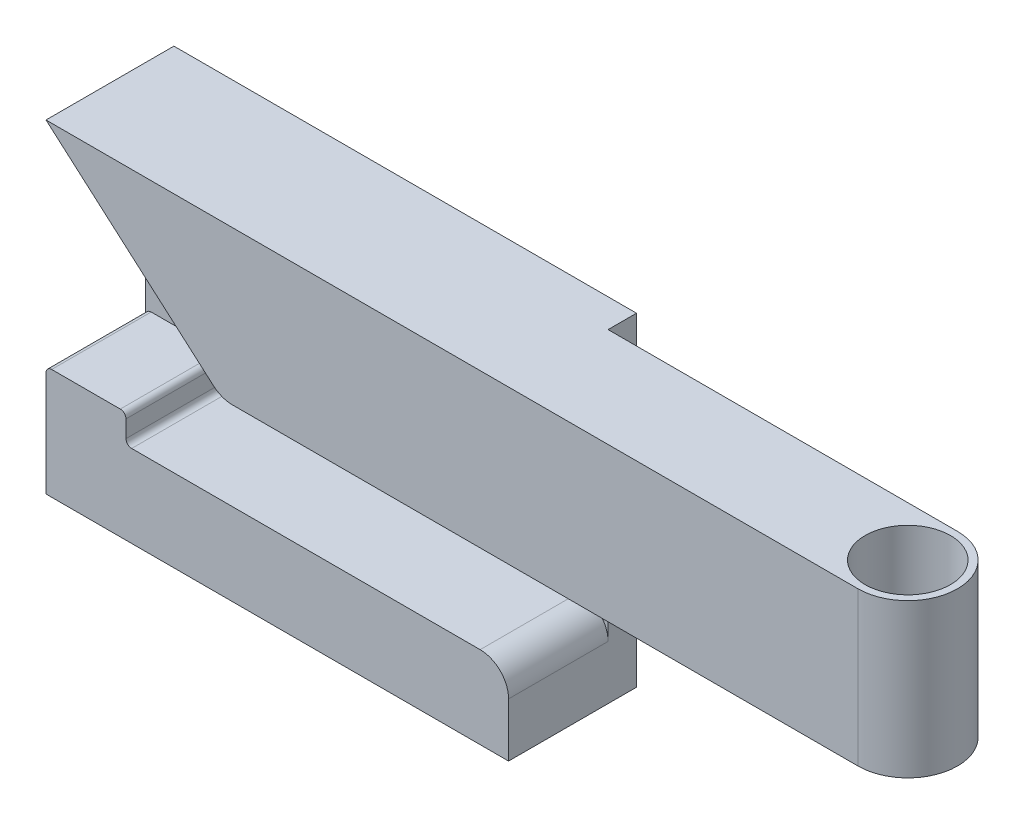
ISO-10303-21;
HEADER;
FILE_DESCRIPTION(('STEP AP214'),'2;1');
FILE_NAME('part.step','',(''),(''),'','','');
FILE_SCHEMA(('AUTOMOTIVE_DESIGN { 1 0 10303 214 1 1 1 1 }'));
ENDSEC;
DATA;
#1=APPLICATION_CONTEXT('core data for automotive mechanical design processes');
#2=APPLICATION_PROTOCOL_DEFINITION('international standard','automotive_design',2000,#1);
#3=PRODUCT_CONTEXT('',#1,'mechanical');
#4=PRODUCT('Part','Part','',(#3));
#5=PRODUCT_RELATED_PRODUCT_CATEGORY('part','',(#4));
#6=PRODUCT_DEFINITION_FORMATION('','',#4);
#7=PRODUCT_DEFINITION_CONTEXT('part definition',#1,'design');
#8=PRODUCT_DEFINITION('design','',#6,#7);
#9=PRODUCT_DEFINITION_SHAPE('','',#8);
#10=(LENGTH_UNIT() NAMED_UNIT(*) SI_UNIT(.MILLI.,.METRE.));
#11=(NAMED_UNIT(*) PLANE_ANGLE_UNIT() SI_UNIT($,.RADIAN.));
#12=(NAMED_UNIT(*) SI_UNIT($,.STERADIAN.) SOLID_ANGLE_UNIT());
#13=UNCERTAINTY_MEASURE_WITH_UNIT(LENGTH_MEASURE(1.E-05),#10,'distance_accuracy_value','');
#14=(GEOMETRIC_REPRESENTATION_CONTEXT(3) GLOBAL_UNCERTAINTY_ASSIGNED_CONTEXT((#13)) GLOBAL_UNIT_ASSIGNED_CONTEXT((#10,
#11,#12)) REPRESENTATION_CONTEXT('',''));
#15=CARTESIAN_POINT('',(0.,0.,0.));
#16=DIRECTION('',(0.,0.,1.));
#17=DIRECTION('',(1.,0.,0.));
#18=AXIS2_PLACEMENT_3D('',#15,#16,#17);
#19=CARTESIAN_POINT('',(0.,0.,0.));
#20=DIRECTION('',(0.,0.,1.));
#21=DIRECTION('',(1.,0.,0.));
#22=AXIS2_PLACEMENT_3D('',#19,#20,#21);
#23=PLANE('',#22);
#24=DIRECTION('',(0.,1.,0.));
#25=VECTOR('',#24,1.);
#26=CARTESIAN_POINT('',(28.1359432064245,-0.578882054731753,0.));
#27=LINE('',#26,#25);
#28=CARTESIAN_POINT('',(28.1359432064245,1.42111794526825,0.));
#29=VERTEX_POINT('',#28);
#30=CARTESIAN_POINT('',(28.1359432064245,7.42111794526825,0.));
#31=VERTEX_POINT('',#30);
#32=EDGE_CURVE('E228',#29,#31,#27,.T.);
#33=ORIENTED_EDGE('',*,*,#32,.F.);
#34=CARTESIAN_POINT('',(30.1359432064245,1.42111794526825,0.));
#35=DIRECTION('',(0.,0.,1.));
#36=DIRECTION('',(1.,0.,0.));
#37=AXIS2_PLACEMENT_3D('',#34,#35,#36);
#38=CIRCLE('',#37,2.);
#39=CARTESIAN_POINT('',(30.1359432064245,-0.578882054731753,0.));
#40=VERTEX_POINT('',#39);
#41=EDGE_CURVE('E241',#29,#40,#38,.T.);
#42=ORIENTED_EDGE('',*,*,#41,.T.);
#43=DIRECTION('',(-1.,0.,0.));
#44=VECTOR('',#43,1.);
#45=CARTESIAN_POINT('',(28.1359432064245,-0.578882054731753,0.));
#46=LINE('',#45,#44);
#47=CARTESIAN_POINT('',(152.732130766672,-0.578882054731721,0.));
#48=VERTEX_POINT('',#47);
#49=EDGE_CURVE('E209',#48,#40,#46,.T.);
#50=ORIENTED_EDGE('',*,*,#49,.F.);
#51=CARTESIAN_POINT('',(152.732130766672,-10.5788820547317,0.));
#52=DIRECTION('',(0.,0.,1.));
#53=DIRECTION('',(1.,0.,0.));
#54=AXIS2_PLACEMENT_3D('',#51,#52,#53);
#55=CIRCLE('',#54,10.);
#56=CARTESIAN_POINT('',(162.732130766672,-10.5788820547317,0.));
#57=VERTEX_POINT('',#56);
#58=EDGE_CURVE('E41',#48,#57,#55,.F.);
#59=ORIENTED_EDGE('',*,*,#58,.T.);
#60=DIRECTION('',(0.,-1.,0.));
#61=VECTOR('',#60,1.);
#62=CARTESIAN_POINT('',(162.732130766672,84.4272602811582,0.));
#63=LINE('',#62,#61);
#64=CARTESIAN_POINT('',(162.732130766672,30.4211179452683,0.));
#65=VERTEX_POINT('',#64);
#66=EDGE_CURVE('E201',#65,#57,#63,.T.);
#67=ORIENTED_EDGE('',*,*,#66,.F.);
#68=DIRECTION('',(1.,0.,0.));
#69=VECTOR('',#68,1.);
#70=CARTESIAN_POINT('',(285.666954550156,30.4211179452683,0.));
#71=LINE('',#70,#69);
#72=CARTESIAN_POINT('',(65.5262284106787,30.4211179452683,0.));
#73=VERTEX_POINT('',#72);
#74=EDGE_CURVE('E169',#73,#65,#71,.T.);
#75=ORIENTED_EDGE('',*,*,#74,.F.);
#76=CARTESIAN_POINT('',(65.5262284106787,40.4211179452683,0.));
#77=DIRECTION('',(0.,0.,1.));
#78=DIRECTION('',(1.,0.,0.));
#79=AXIS2_PLACEMENT_3D('',#76,#77,#78);
#80=CIRCLE('',#79,10.);
#81=CARTESIAN_POINT('',(58.9441940013667,32.8927168511026,0.));
#82=VERTEX_POINT('',#81);
#83=EDGE_CURVE('E11',#73,#82,#80,.F.);
#84=ORIENTED_EDGE('',*,*,#83,.T.);
#85=DIRECTION('',(0.752840109416559,-0.658203440931194,0.));
#86=VECTOR('',#85,1.);
#87=CARTESIAN_POINT('',(61.7711600653389,30.4211179452683,0.));
#88=LINE('',#87,#86);
#89=CARTESIAN_POINT('',(0.,84.4272602811582,0.));
#90=VERTEX_POINT('',#89);
#91=EDGE_CURVE('E162',#90,#82,#88,.T.);
#92=ORIENTED_EDGE('',*,*,#91,.F.);
#93=DIRECTION('',(0.,1.,0.));
#94=VECTOR('',#93,1.);
#95=CARTESIAN_POINT('',(0.,84.4272602811582,0.));
#96=LINE('',#95,#94);
#97=CARTESIAN_POINT('',(0.,7.42111794526827,0.));
#98=VERTEX_POINT('',#97);
#99=EDGE_CURVE('E184',#98,#90,#96,.T.);
#100=ORIENTED_EDGE('',*,*,#99,.F.);
#101=CARTESIAN_POINT('',(2.,7.42111794526824,0.));
#102=DIRECTION('',(0.,0.,1.));
#103=DIRECTION('',(1.,0.,0.));
#104=AXIS2_PLACEMENT_3D('',#101,#102,#103);
#105=CIRCLE('',#104,2.);
#106=CARTESIAN_POINT('',(2.,9.42111794526824,0.));
#107=VERTEX_POINT('',#106);
#108=EDGE_CURVE('E261',#98,#107,#105,.F.);
#109=ORIENTED_EDGE('',*,*,#108,.T.);
#110=DIRECTION('',(-1.,0.,0.));
#111=VECTOR('',#110,1.);
#112=CARTESIAN_POINT('',(0.,9.42111794526824,0.));
#113=LINE('',#112,#111);
#114=CARTESIAN_POINT('',(26.1359432064245,9.42111794526825,0.));
#115=VERTEX_POINT('',#114);
#116=EDGE_CURVE('E213',#115,#107,#113,.T.);
#117=ORIENTED_EDGE('',*,*,#116,.F.);
#118=CARTESIAN_POINT('',(26.1359432064245,7.42111794526825,0.));
#119=DIRECTION('',(0.,0.,1.));
#120=DIRECTION('',(1.,0.,0.));
#121=AXIS2_PLACEMENT_3D('',#118,#119,#120);
#122=CIRCLE('',#121,2.);
#123=EDGE_CURVE('E263',#115,#31,#122,.F.);
#124=ORIENTED_EDGE('',*,*,#123,.T.);
#125=EDGE_LOOP('',(#33,#42,#50,#59,#67,#75,#84,#92,#100,#109,#117,#124));
#126=FACE_BOUND('',#125,.T.);
#127=ADVANCED_FACE('F33',(#126),#23,.T.);
#128=CARTESIAN_POINT('',(0.,0.,35.));
#129=DIRECTION('',(1.,0.,0.));
#130=DIRECTION('',(0.,0.,-1.));
#131=AXIS2_PLACEMENT_3D('',#128,#129,#130);
#132=PLANE('',#131);
#133=DIRECTION('',(0.,-1.,0.));
#134=VECTOR('',#133,1.);
#135=CARTESIAN_POINT('',(0.,0.,35.));
#136=LINE('',#135,#134);
#137=CARTESIAN_POINT('',(0.,7.42111794526824,35.));
#138=VERTEX_POINT('',#137);
#139=CARTESIAN_POINT('',(0.,-29.5337532453947,35.));
#140=VERTEX_POINT('',#139);
#141=EDGE_CURVE('E210',#138,#140,#136,.T.);
#142=ORIENTED_EDGE('',*,*,#141,.F.);
#143=DIRECTION('',(0.,0.,-1.));
#144=VECTOR('',#143,1.);
#145=CARTESIAN_POINT('',(0.,7.42111794526824,35.));
#146=LINE('',#145,#144);
#147=EDGE_CURVE('E247',#138,#98,#146,.T.);
#148=ORIENTED_EDGE('',*,*,#147,.T.);
#149=ORIENTED_EDGE('',*,*,#99,.T.);
#150=DIRECTION('',(0.,0.,1.));
#151=VECTOR('',#150,1.);
#152=CARTESIAN_POINT('',(0.,84.4272602811582,-10.));
#153=LINE('',#152,#151);
#154=CARTESIAN_POINT('',(0.,84.4272602811582,-10.));
#155=VERTEX_POINT('',#154);
#156=EDGE_CURVE('E206',#155,#90,#153,.T.);
#157=ORIENTED_EDGE('',*,*,#156,.F.);
#158=DIRECTION('',(0.,1.,0.));
#159=VECTOR('',#158,1.);
#160=CARTESIAN_POINT('',(0.,84.4272602811582,-10.));
#161=LINE('',#160,#159);
#162=CARTESIAN_POINT('',(0.,-29.5337532453947,-10.));
#163=VERTEX_POINT('',#162);
#164=EDGE_CURVE('E186',#163,#155,#161,.T.);
#165=ORIENTED_EDGE('',*,*,#164,.F.);
#166=DIRECTION('',(0.,0.,-1.));
#167=VECTOR('',#166,1.);
#168=CARTESIAN_POINT('',(0.,-29.5337532453947,35.));
#169=LINE('',#168,#167);
#170=EDGE_CURVE('E234',#140,#163,#169,.T.);
#171=ORIENTED_EDGE('',*,*,#170,.F.);
#172=EDGE_LOOP('',(#142,#148,#149,#157,#165,#171));
#173=FACE_BOUND('',#172,.T.);
#174=ADVANCED_FACE('F325',(#173),#132,.F.);
#175=CARTESIAN_POINT('',(0.,-29.5337532453947,35.));
#176=DIRECTION('',(0.,1.,0.));
#177=DIRECTION('',(0.,0.,1.));
#178=AXIS2_PLACEMENT_3D('',#175,#176,#177);
#179=PLANE('',#178);
#180=ORIENTED_EDGE('',*,*,#170,.T.);
#181=DIRECTION('',(-1.,0.,0.));
#182=VECTOR('',#181,1.);
#183=CARTESIAN_POINT('',(0.,-29.5337532453947,-10.));
#184=LINE('',#183,#182);
#185=CARTESIAN_POINT('',(162.732130766672,-29.5337532453947,-10.));
#186=VERTEX_POINT('',#185);
#187=EDGE_CURVE('E195',#186,#163,#184,.T.);
#188=ORIENTED_EDGE('',*,*,#187,.F.);
#189=DIRECTION('',(0.,0.,-1.));
#190=VECTOR('',#189,1.);
#191=CARTESIAN_POINT('',(162.732130766672,-29.5337532453947,35.));
#192=LINE('',#191,#190);
#193=CARTESIAN_POINT('',(162.732130766672,-29.5337532453947,35.));
#194=VERTEX_POINT('',#193);
#195=EDGE_CURVE('E226',#194,#186,#192,.T.);
#196=ORIENTED_EDGE('',*,*,#195,.F.);
#197=DIRECTION('',(1.,0.,0.));
#198=VECTOR('',#197,1.);
#199=CARTESIAN_POINT('',(0.,-29.5337532453947,35.));
#200=LINE('',#199,#198);
#201=EDGE_CURVE('E212',#140,#194,#200,.T.);
#202=ORIENTED_EDGE('',*,*,#201,.F.);
#203=EDGE_LOOP('',(#180,#188,#196,#202));
#204=FACE_BOUND('',#203,.T.);
#205=ADVANCED_FACE('F296',(#204),#179,.F.);
#206=CARTESIAN_POINT('',(162.732130766672,-29.5337532453947,35.));
#207=DIRECTION('',(-1.,0.,0.));
#208=DIRECTION('',(0.,0.,1.));
#209=AXIS2_PLACEMENT_3D('',#206,#207,#208);
#210=PLANE('',#209);
#211=ORIENTED_EDGE('',*,*,#66,.T.);
#212=DIRECTION('',(0.,0.,-1.));
#213=VECTOR('',#212,1.);
#214=CARTESIAN_POINT('',(162.732130766672,-10.5788820547317,35.));
#215=LINE('',#214,#213);
#216=CARTESIAN_POINT('',(162.732130766672,-10.5788820547317,35.));
#217=VERTEX_POINT('',#216);
#218=EDGE_CURVE('E268',#57,#217,#215,.F.);
#219=ORIENTED_EDGE('',*,*,#218,.T.);
#220=DIRECTION('',(0.,1.,0.));
#221=VECTOR('',#220,1.);
#222=CARTESIAN_POINT('',(162.732130766672,-29.5337532453947,35.));
#223=LINE('',#222,#221);
#224=EDGE_CURVE('E215',#194,#217,#223,.T.);
#225=ORIENTED_EDGE('',*,*,#224,.F.);
#226=ORIENTED_EDGE('',*,*,#195,.T.);
#227=DIRECTION('',(0.,-1.,0.));
#228=VECTOR('',#227,1.);
#229=CARTESIAN_POINT('',(162.732130766672,84.4272602811582,-10.));
#230=LINE('',#229,#228);
#231=CARTESIAN_POINT('',(162.732130766672,84.4272602811582,-10.));
#232=VERTEX_POINT('',#231);
#233=EDGE_CURVE('E192',#232,#186,#230,.T.);
#234=ORIENTED_EDGE('',*,*,#233,.F.);
#235=DIRECTION('',(0.,0.,1.));
#236=VECTOR('',#235,1.);
#237=CARTESIAN_POINT('',(162.732130766672,84.4272602811582,-10.));
#238=LINE('',#237,#236);
#239=CARTESIAN_POINT('',(162.732130766672,84.4272602811582,0.));
#240=VERTEX_POINT('',#239);
#241=EDGE_CURVE('E198',#232,#240,#238,.T.);
#242=ORIENTED_EDGE('',*,*,#241,.T.);
#243=EDGE_CURVE('E190',#240,#65,#63,.T.);
#244=ORIENTED_EDGE('',*,*,#243,.T.);
#245=EDGE_LOOP('',(#211,#219,#225,#226,#234,#242,#244));
#246=FACE_BOUND('',#245,.T.);
#247=ADVANCED_FACE('F286',(#246),#210,.F.);
#248=CARTESIAN_POINT('',(28.1359432064245,-0.578882054731753,35.));
#249=DIRECTION('',(0.,-1.,0.));
#250=DIRECTION('',(1.,0.,0.));
#251=AXIS2_PLACEMENT_3D('',#248,#249,#250);
#252=PLANE('',#251);
#253=DIRECTION('',(-1.,0.,0.));
#254=VECTOR('',#253,1.);
#255=CARTESIAN_POINT('',(28.1359432064245,-0.578882054731753,35.));
#256=LINE('',#255,#254);
#257=CARTESIAN_POINT('',(152.732130766672,-0.578882054731721,35.));
#258=VERTEX_POINT('',#257);
#259=CARTESIAN_POINT('',(30.1359432064245,-0.578882054731753,35.));
#260=VERTEX_POINT('',#259);
#261=EDGE_CURVE('E218',#258,#260,#256,.T.);
#262=ORIENTED_EDGE('',*,*,#261,.F.);
#263=DIRECTION('',(0.,0.,-1.));
#264=VECTOR('',#263,1.);
#265=CARTESIAN_POINT('',(152.732130766672,-0.578882054731721,35.));
#266=LINE('',#265,#264);
#267=EDGE_CURVE('E265',#258,#48,#266,.T.);
#268=ORIENTED_EDGE('',*,*,#267,.T.);
#269=ORIENTED_EDGE('',*,*,#49,.T.);
#270=DIRECTION('',(0.,0.,-1.));
#271=VECTOR('',#270,1.);
#272=CARTESIAN_POINT('',(30.1359432064245,-0.578882054731753,35.));
#273=LINE('',#272,#271);
#274=EDGE_CURVE('E244',#40,#260,#273,.F.);
#275=ORIENTED_EDGE('',*,*,#274,.T.);
#276=EDGE_LOOP('',(#262,#268,#269,#275));
#277=FACE_BOUND('',#276,.T.);
#278=ADVANCED_FACE('F350',(#277),#252,.F.);
#279=CARTESIAN_POINT('',(28.1359432064245,-0.578882054731753,35.));
#280=DIRECTION('',(-1.,0.,0.));
#281=DIRECTION('',(0.,0.,1.));
#282=AXIS2_PLACEMENT_3D('',#279,#280,#281);
#283=PLANE('',#282);
#284=DIRECTION('',(0.,1.,0.));
#285=VECTOR('',#284,1.);
#286=CARTESIAN_POINT('',(28.1359432064245,-0.578882054731753,35.));
#287=LINE('',#286,#285);
#288=CARTESIAN_POINT('',(28.1359432064245,1.42111794526825,35.));
#289=VERTEX_POINT('',#288);
#290=CARTESIAN_POINT('',(28.1359432064245,7.42111794526825,35.));
#291=VERTEX_POINT('',#290);
#292=EDGE_CURVE('E220',#289,#291,#287,.T.);
#293=ORIENTED_EDGE('',*,*,#292,.F.);
#294=DIRECTION('',(0.,0.,-1.));
#295=VECTOR('',#294,1.);
#296=CARTESIAN_POINT('',(28.1359432064245,1.42111794526825,0.));
#297=LINE('',#296,#295);
#298=EDGE_CURVE('E238',#289,#29,#297,.T.);
#299=ORIENTED_EDGE('',*,*,#298,.T.);
#300=ORIENTED_EDGE('',*,*,#32,.T.);
#301=DIRECTION('',(0.,0.,-1.));
#302=VECTOR('',#301,1.);
#303=CARTESIAN_POINT('',(28.1359432064245,7.42111794526825,35.));
#304=LINE('',#303,#302);
#305=EDGE_CURVE('E236',#31,#291,#304,.F.);
#306=ORIENTED_EDGE('',*,*,#305,.T.);
#307=EDGE_LOOP('',(#293,#299,#300,#306));
#308=FACE_BOUND('',#307,.T.);
#309=ADVANCED_FACE('F343',(#308),#283,.F.);
#310=CARTESIAN_POINT('',(0.,9.42111794526824,35.));
#311=DIRECTION('',(0.,-1.,0.));
#312=DIRECTION('',(1.,0.,0.));
#313=AXIS2_PLACEMENT_3D('',#310,#311,#312);
#314=PLANE('',#313);
#315=ORIENTED_EDGE('',*,*,#116,.T.);
#316=DIRECTION('',(0.,0.,-1.));
#317=VECTOR('',#316,1.);
#318=CARTESIAN_POINT('',(2.,9.42111794526824,35.));
#319=LINE('',#318,#317);
#320=CARTESIAN_POINT('',(2.,9.42111794526824,35.));
#321=VERTEX_POINT('',#320);
#322=EDGE_CURVE('E253',#107,#321,#319,.F.);
#323=ORIENTED_EDGE('',*,*,#322,.T.);
#324=DIRECTION('',(-1.,0.,0.));
#325=VECTOR('',#324,1.);
#326=CARTESIAN_POINT('',(0.,9.42111794526824,35.));
#327=LINE('',#326,#325);
#328=CARTESIAN_POINT('',(26.1359432064245,9.42111794526825,35.));
#329=VERTEX_POINT('',#328);
#330=EDGE_CURVE('E223',#329,#321,#327,.T.);
#331=ORIENTED_EDGE('',*,*,#330,.F.);
#332=DIRECTION('',(0.,0.,-1.));
#333=VECTOR('',#332,1.);
#334=CARTESIAN_POINT('',(26.1359432064245,9.42111794526825,35.));
#335=LINE('',#334,#333);
#336=EDGE_CURVE('E250',#329,#115,#335,.T.);
#337=ORIENTED_EDGE('',*,*,#336,.T.);
#338=EDGE_LOOP('',(#315,#323,#331,#337));
#339=FACE_BOUND('',#338,.T.);
#340=ADVANCED_FACE('F335',(#339),#314,.F.);
#341=CARTESIAN_POINT('',(0.,0.,35.));
#342=DIRECTION('',(0.,0.,-1.));
#343=DIRECTION('',(-1.,0.,0.));
#344=AXIS2_PLACEMENT_3D('',#341,#342,#343);
#345=PLANE('',#344);
#346=ORIENTED_EDGE('',*,*,#224,.T.);
#347=CARTESIAN_POINT('',(152.732130766672,-10.5788820547317,35.));
#348=DIRECTION('',(0.,0.,-1.));
#349=DIRECTION('',(-1.,0.,0.));
#350=AXIS2_PLACEMENT_3D('',#347,#348,#349);
#351=CIRCLE('',#350,10.);
#352=EDGE_CURVE('E270',#217,#258,#351,.F.);
#353=ORIENTED_EDGE('',*,*,#352,.T.);
#354=ORIENTED_EDGE('',*,*,#261,.T.);
#355=CARTESIAN_POINT('',(30.1359432064245,1.42111794526825,35.));
#356=DIRECTION('',(0.,0.,-1.));
#357=DIRECTION('',(-1.,0.,0.));
#358=AXIS2_PLACEMENT_3D('',#355,#356,#357);
#359=CIRCLE('',#358,2.);
#360=EDGE_CURVE('E259',#260,#289,#359,.T.);
#361=ORIENTED_EDGE('',*,*,#360,.T.);
#362=ORIENTED_EDGE('',*,*,#292,.T.);
#363=CARTESIAN_POINT('',(26.1359432064245,7.42111794526825,35.));
#364=DIRECTION('',(0.,0.,-1.));
#365=DIRECTION('',(-1.,0.,0.));
#366=AXIS2_PLACEMENT_3D('',#363,#364,#365);
#367=CIRCLE('',#366,2.);
#368=EDGE_CURVE('E255',#291,#329,#367,.F.);
#369=ORIENTED_EDGE('',*,*,#368,.T.);
#370=ORIENTED_EDGE('',*,*,#330,.T.);
#371=CARTESIAN_POINT('',(2.,7.42111794526824,35.));
#372=DIRECTION('',(0.,0.,-1.));
#373=DIRECTION('',(-1.,0.,0.));
#374=AXIS2_PLACEMENT_3D('',#371,#372,#373);
#375=CIRCLE('',#374,2.);
#376=EDGE_CURVE('E257',#321,#138,#375,.F.);
#377=ORIENTED_EDGE('',*,*,#376,.T.);
#378=ORIENTED_EDGE('',*,*,#141,.T.);
#379=ORIENTED_EDGE('',*,*,#201,.T.);
#380=EDGE_LOOP('',(#346,#353,#354,#361,#362,#369,#370,#377,#378,#379));
#381=FACE_BOUND('',#380,.T.);
#382=ADVANCED_FACE('F288',(#381),#345,.F.);
#383=CARTESIAN_POINT('',(0.,84.4272602811582,-10.));
#384=DIRECTION('',(0.,-1.,0.));
#385=DIRECTION('',(1.,0.,0.));
#386=AXIS2_PLACEMENT_3D('',#383,#384,#385);
#387=PLANE('',#386);
#388=CARTESIAN_POINT('',(285.666954550156,84.4272602811582,17.5));
#389=DIRECTION('',(0.,1.,0.));
#390=DIRECTION('',(0.,0.,1.));
#391=AXIS2_PLACEMENT_3D('',#388,#389,#390);
#392=CIRCLE('',#391,15.);
#393=CARTESIAN_POINT('',(285.666954550156,84.4272602811582,32.5));
#394=VERTEX_POINT('',#393);
#395=EDGE_CURVE('E310',#394,#394,#392,.T.);
#396=ORIENTED_EDGE('',*,*,#395,.F.);
#397=EDGE_LOOP('',(#396));
#398=FACE_BOUND('',#397,.T.);
#399=DIRECTION('',(-1.,0.,0.));
#400=VECTOR('',#399,1.);
#401=CARTESIAN_POINT('',(0.,84.4272602811582,35.));
#402=LINE('',#401,#400);
#403=CARTESIAN_POINT('',(285.666954550156,84.4272602811582,35.));
#404=VERTEX_POINT('',#403);
#405=CARTESIAN_POINT('',(0.,84.4272602811582,35.));
#406=VERTEX_POINT('',#405);
#407=EDGE_CURVE('E185',#404,#406,#402,.T.);
#408=ORIENTED_EDGE('',*,*,#407,.F.);
#409=CARTESIAN_POINT('',(285.666954550156,84.4272602811582,17.5));
#410=DIRECTION('',(0.,1.,0.));
#411=DIRECTION('',(0.,0.,1.));
#412=AXIS2_PLACEMENT_3D('',#409,#410,#411);
#413=CIRCLE('',#412,17.4999999999999);
#414=CARTESIAN_POINT('',(285.666954550156,84.4272602811582,0.));
#415=VERTEX_POINT('',#414);
#416=EDGE_CURVE('E163',#404,#415,#413,.T.);
#417=ORIENTED_EDGE('',*,*,#416,.T.);
#418=DIRECTION('',(-1.,0.,0.));
#419=VECTOR('',#418,1.);
#420=CARTESIAN_POINT('',(0.,84.4272602811582,0.));
#421=LINE('',#420,#419);
#422=EDGE_CURVE('E176',#415,#240,#421,.T.);
#423=ORIENTED_EDGE('',*,*,#422,.T.);
#424=ORIENTED_EDGE('',*,*,#241,.F.);
#425=DIRECTION('',(1.,0.,0.));
#426=VECTOR('',#425,1.);
#427=CARTESIAN_POINT('',(0.,84.4272602811582,-10.));
#428=LINE('',#427,#426);
#429=EDGE_CURVE('E189',#155,#232,#428,.T.);
#430=ORIENTED_EDGE('',*,*,#429,.F.);
#431=ORIENTED_EDGE('',*,*,#156,.T.);
#432=DIRECTION('',(0.,0.,-1.));
#433=VECTOR('',#432,1.);
#434=CARTESIAN_POINT('',(0.,84.4272602811582,35.));
#435=LINE('',#434,#433);
#436=EDGE_CURVE('E182',#406,#90,#435,.T.);
#437=ORIENTED_EDGE('',*,*,#436,.F.);
#438=EDGE_LOOP('',(#408,#417,#423,#424,#430,#431,#437));
#439=FACE_BOUND('',#438,.T.);
#440=ADVANCED_FACE('F305',(#398,#439),#387,.F.);
#441=CARTESIAN_POINT('',(0.,0.,-10.));
#442=DIRECTION('',(0.,0.,1.));
#443=DIRECTION('',(1.,0.,0.));
#444=AXIS2_PLACEMENT_3D('',#441,#442,#443);
#445=PLANE('',#444);
#446=ORIENTED_EDGE('',*,*,#164,.T.);
#447=ORIENTED_EDGE('',*,*,#429,.T.);
#448=ORIENTED_EDGE('',*,*,#233,.T.);
#449=ORIENTED_EDGE('',*,*,#187,.T.);
#450=EDGE_LOOP('',(#446,#447,#448,#449));
#451=FACE_BOUND('',#450,.T.);
#452=ADVANCED_FACE('F299',(#451),#445,.F.);
#453=CARTESIAN_POINT('',(0.,0.,0.));
#454=DIRECTION('',(0.,0.,1.));
#455=DIRECTION('',(1.,0.,0.));
#456=AXIS2_PLACEMENT_3D('',#453,#454,#455);
#457=PLANE('',#456);
#458=CARTESIAN_POINT('',(285.666954550156,30.4211179452683,0.));
#459=VERTEX_POINT('',#458);
#460=EDGE_CURVE('E166',#65,#459,#71,.T.);
#461=ORIENTED_EDGE('',*,*,#460,.F.);
#462=ORIENTED_EDGE('',*,*,#243,.F.);
#463=ORIENTED_EDGE('',*,*,#422,.F.);
#464=DIRECTION('',(0.,1.,0.));
#465=VECTOR('',#464,1.);
#466=CARTESIAN_POINT('',(285.666954550156,84.4272602811582,0.));
#467=LINE('',#466,#465);
#468=EDGE_CURVE('E156',#459,#415,#467,.T.);
#469=ORIENTED_EDGE('',*,*,#468,.F.);
#470=EDGE_LOOP('',(#461,#462,#463,#469));
#471=FACE_BOUND('',#470,.T.);
#472=ADVANCED_FACE('F175',(#471),#457,.F.);
#473=CARTESIAN_POINT('',(61.7711600653389,30.4211179452683,35.));
#474=DIRECTION('',(0.658203440931194,0.752840109416559,0.));
#475=DIRECTION('',(-0.752840109416559,0.658203440931194,0.));
#476=AXIS2_PLACEMENT_3D('',#473,#474,#475);
#477=PLANE('',#476);
#478=ORIENTED_EDGE('',*,*,#91,.T.);
#479=DIRECTION('',(0.,0.,-1.));
#480=VECTOR('',#479,1.);
#481=CARTESIAN_POINT('',(58.9441940013667,32.8927168511026,35.));
#482=LINE('',#481,#480);
#483=CARTESIAN_POINT('',(58.9441940013667,32.8927168511026,35.));
#484=VERTEX_POINT('',#483);
#485=EDGE_CURVE('E48',#82,#484,#482,.F.);
#486=ORIENTED_EDGE('',*,*,#485,.T.);
#487=DIRECTION('',(0.752840109416559,-0.658203440931194,0.));
#488=VECTOR('',#487,1.);
#489=CARTESIAN_POINT('',(61.7711600653389,30.4211179452683,35.));
#490=LINE('',#489,#488);
#491=EDGE_CURVE('E178',#406,#484,#490,.T.);
#492=ORIENTED_EDGE('',*,*,#491,.F.);
#493=ORIENTED_EDGE('',*,*,#436,.T.);
#494=EDGE_LOOP('',(#478,#486,#492,#493));
#495=FACE_BOUND('',#494,.T.);
#496=ADVANCED_FACE('F318',(#495),#477,.F.);
#497=CARTESIAN_POINT('',(285.666954550156,30.4211179452683,35.));
#498=DIRECTION('',(0.,1.,0.));
#499=DIRECTION('',(-1.,0.,0.));
#500=AXIS2_PLACEMENT_3D('',#497,#498,#499);
#501=PLANE('',#500);
#502=CARTESIAN_POINT('',(285.666954550156,30.4211179452683,17.5));
#503=DIRECTION('',(0.,1.,0.));
#504=DIRECTION('',(-1.,0.,0.));
#505=AXIS2_PLACEMENT_3D('',#502,#503,#504);
#506=CIRCLE('',#505,15.);
#507=CARTESIAN_POINT('',(270.666954550156,30.4211179452683,17.5));
#508=VERTEX_POINT('',#507);
#509=EDGE_CURVE('E307',#508,#508,#506,.F.);
#510=ORIENTED_EDGE('',*,*,#509,.F.);
#511=EDGE_LOOP('',(#510));
#512=FACE_BOUND('',#511,.T.);
#513=DIRECTION('',(1.,0.,0.));
#514=VECTOR('',#513,1.);
#515=CARTESIAN_POINT('',(285.666954550156,30.4211179452683,35.));
#516=LINE('',#515,#514);
#517=CARTESIAN_POINT('',(65.5262284106787,30.4211179452683,35.));
#518=VERTEX_POINT('',#517);
#519=CARTESIAN_POINT('',(285.666954550156,30.4211179452683,35.));
#520=VERTEX_POINT('',#519);
#521=EDGE_CURVE('E315',#518,#520,#516,.T.);
#522=ORIENTED_EDGE('',*,*,#521,.F.);
#523=DIRECTION('',(0.,0.,-1.));
#524=VECTOR('',#523,1.);
#525=CARTESIAN_POINT('',(65.5262284106787,30.4211179452683,35.));
#526=LINE('',#525,#524);
#527=EDGE_CURVE('E272',#518,#73,#526,.T.);
#528=ORIENTED_EDGE('',*,*,#527,.T.);
#529=ORIENTED_EDGE('',*,*,#74,.T.);
#530=ORIENTED_EDGE('',*,*,#460,.T.);
#531=CARTESIAN_POINT('',(285.666954550156,30.4211179452683,17.5));
#532=DIRECTION('',(0.,1.,0.));
#533=DIRECTION('',(-1.,0.,0.));
#534=AXIS2_PLACEMENT_3D('',#531,#532,#533);
#535=CIRCLE('',#534,17.4999999999999);
#536=EDGE_CURVE('E152',#459,#520,#535,.F.);
#537=ORIENTED_EDGE('',*,*,#536,.T.);
#538=EDGE_LOOP('',(#522,#528,#529,#530,#537));
#539=FACE_BOUND('',#538,.T.);
#540=ADVANCED_FACE('F167',(#512,#539),#501,.F.);
#541=CARTESIAN_POINT('',(0.,0.,35.));
#542=DIRECTION('',(0.,0.,1.));
#543=DIRECTION('',(1.,0.,0.));
#544=AXIS2_PLACEMENT_3D('',#541,#542,#543);
#545=PLANE('',#544);
#546=ORIENTED_EDGE('',*,*,#491,.T.);
#547=CARTESIAN_POINT('',(65.5262284106787,40.4211179452683,35.));
#548=DIRECTION('',(0.,0.,1.));
#549=DIRECTION('',(1.,0.,0.));
#550=AXIS2_PLACEMENT_3D('',#547,#548,#549);
#551=CIRCLE('',#550,10.);
#552=EDGE_CURVE('E275',#484,#518,#551,.T.);
#553=ORIENTED_EDGE('',*,*,#552,.T.);
#554=ORIENTED_EDGE('',*,*,#521,.T.);
#555=DIRECTION('',(0.,1.,0.));
#556=VECTOR('',#555,1.);
#557=CARTESIAN_POINT('',(285.666954550156,84.4272602811582,35.));
#558=LINE('',#557,#556);
#559=EDGE_CURVE('E159',#520,#404,#558,.T.);
#560=ORIENTED_EDGE('',*,*,#559,.T.);
#561=ORIENTED_EDGE('',*,*,#407,.T.);
#562=EDGE_LOOP('',(#546,#553,#554,#560,#561));
#563=FACE_BOUND('',#562,.T.);
#564=ADVANCED_FACE('F323',(#563),#545,.T.);
#565=CARTESIAN_POINT('',(285.666954550156,-19.0763567377899,17.5));
#566=DIRECTION('',(0.,1.,0.));
#567=DIRECTION('',(0.,0.,1.));
#568=AXIS2_PLACEMENT_3D('',#565,#566,#567);
#569=CYLINDRICAL_SURFACE('',#568,17.4999999999999);
#570=ORIENTED_EDGE('',*,*,#468,.T.);
#571=ORIENTED_EDGE('',*,*,#416,.F.);
#572=ORIENTED_EDGE('',*,*,#559,.F.);
#573=ORIENTED_EDGE('',*,*,#536,.F.);
#574=EDGE_LOOP('',(#570,#571,#572,#573));
#575=FACE_BOUND('',#574,.T.);
#576=ADVANCED_FACE('F154',(#575),#569,.T.);
#577=CARTESIAN_POINT('',(285.666954550156,-29.5347532453947,17.5));
#578=DIRECTION('',(0.,1.,0.));
#579=DIRECTION('',(0.,0.,1.));
#580=AXIS2_PLACEMENT_3D('',#577,#578,#579);
#581=CYLINDRICAL_SURFACE('',#580,15.);
#582=ORIENTED_EDGE('',*,*,#395,.T.);
#583=EDGE_LOOP('',(#582));
#584=FACE_BOUND('',#583,.T.);
#585=ORIENTED_EDGE('',*,*,#509,.T.);
#586=EDGE_LOOP('',(#585));
#587=FACE_BOUND('',#586,.T.);
#588=ADVANCED_FACE('F425',(#584,#587),#581,.F.);
#589=CARTESIAN_POINT('',(30.1359432064245,1.42111794526825,35.));
#590=DIRECTION('',(0.,0.,1.));
#591=DIRECTION('',(1.,0.,0.));
#592=AXIS2_PLACEMENT_3D('',#589,#590,#591);
#593=CYLINDRICAL_SURFACE('',#592,2.);
#594=ORIENTED_EDGE('',*,*,#360,.F.);
#595=ORIENTED_EDGE('',*,*,#274,.F.);
#596=ORIENTED_EDGE('',*,*,#41,.F.);
#597=ORIENTED_EDGE('',*,*,#298,.F.);
#598=EDGE_LOOP('',(#594,#595,#596,#597));
#599=FACE_BOUND('',#598,.T.);
#600=ADVANCED_FACE('F347',(#599),#593,.F.);
#601=CARTESIAN_POINT('',(2.,7.42111794526824,35.));
#602=DIRECTION('',(0.,0.,-1.));
#603=DIRECTION('',(-1.,0.,0.));
#604=AXIS2_PLACEMENT_3D('',#601,#602,#603);
#605=CYLINDRICAL_SURFACE('',#604,2.);
#606=ORIENTED_EDGE('',*,*,#376,.F.);
#607=ORIENTED_EDGE('',*,*,#322,.F.);
#608=ORIENTED_EDGE('',*,*,#108,.F.);
#609=ORIENTED_EDGE('',*,*,#147,.F.);
#610=EDGE_LOOP('',(#606,#607,#608,#609));
#611=FACE_BOUND('',#610,.T.);
#612=ADVANCED_FACE('F332',(#611),#605,.T.);
#613=CARTESIAN_POINT('',(26.1359432064245,7.42111794526825,35.));
#614=DIRECTION('',(0.,0.,-1.));
#615=DIRECTION('',(-1.,0.,0.));
#616=AXIS2_PLACEMENT_3D('',#613,#614,#615);
#617=CYLINDRICAL_SURFACE('',#616,2.);
#618=ORIENTED_EDGE('',*,*,#368,.F.);
#619=ORIENTED_EDGE('',*,*,#305,.F.);
#620=ORIENTED_EDGE('',*,*,#123,.F.);
#621=ORIENTED_EDGE('',*,*,#336,.F.);
#622=EDGE_LOOP('',(#618,#619,#620,#621));
#623=FACE_BOUND('',#622,.T.);
#624=ADVANCED_FACE('F341',(#623),#617,.T.);
#625=CARTESIAN_POINT('',(152.732130766672,-10.5788820547317,35.));
#626=DIRECTION('',(0.,0.,-1.));
#627=DIRECTION('',(-1.,0.,0.));
#628=AXIS2_PLACEMENT_3D('',#625,#626,#627);
#629=CYLINDRICAL_SURFACE('',#628,10.);
#630=ORIENTED_EDGE('',*,*,#352,.F.);
#631=ORIENTED_EDGE('',*,*,#218,.F.);
#632=ORIENTED_EDGE('',*,*,#58,.F.);
#633=ORIENTED_EDGE('',*,*,#267,.F.);
#634=EDGE_LOOP('',(#630,#631,#632,#633));
#635=FACE_BOUND('',#634,.T.);
#636=ADVANCED_FACE('F283',(#635),#629,.T.);
#637=CARTESIAN_POINT('',(65.5262284106787,40.4211179452683,35.));
#638=DIRECTION('',(0.,0.,-1.));
#639=DIRECTION('',(-1.,0.,0.));
#640=AXIS2_PLACEMENT_3D('',#637,#638,#639);
#641=CYLINDRICAL_SURFACE('',#640,10.);
#642=ORIENTED_EDGE('',*,*,#552,.F.);
#643=ORIENTED_EDGE('',*,*,#485,.F.);
#644=ORIENTED_EDGE('',*,*,#83,.F.);
#645=ORIENTED_EDGE('',*,*,#527,.F.);
#646=EDGE_LOOP('',(#642,#643,#644,#645));
#647=FACE_BOUND('',#646,.T.);
#648=ADVANCED_FACE('F35',(#647),#641,.T.);
#649=CLOSED_SHELL('',(#127,#174,#205,#247,#278,#309,#340,#382,#440,#452,#472,#496,#540,#564,
#576,#588,#600,#612,#624,#636,#648));
#650=MANIFOLD_SOLID_BREP('B2',#649);
#651=ADVANCED_BREP_SHAPE_REPRESENTATION('',(#18,#650),#14);
#652=SHAPE_DEFINITION_REPRESENTATION(#9,#651);
ENDSEC;
END-ISO-10303-21;
